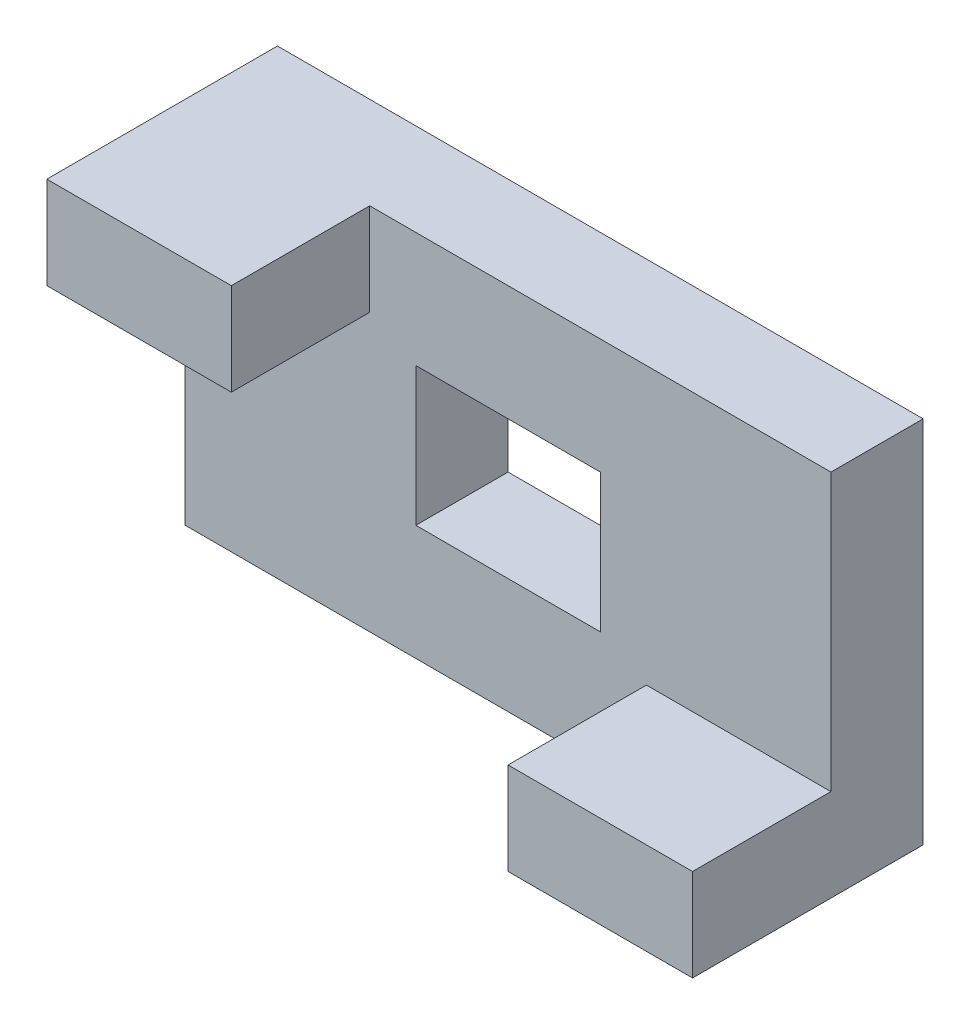
ISO-10303-21;
HEADER;
FILE_DESCRIPTION(('STEP AP214'),'2;1');
FILE_NAME('part.step','',(''),(''),'','','');
FILE_SCHEMA(('AUTOMOTIVE_DESIGN { 1 0 10303 214 1 1 1 1 }'));
ENDSEC;
DATA;
#1=APPLICATION_CONTEXT('core data for automotive mechanical design processes');
#2=APPLICATION_PROTOCOL_DEFINITION('international standard','automotive_design',2000,#1);
#3=PRODUCT_CONTEXT('',#1,'mechanical');
#4=PRODUCT('Part','Part','',(#3));
#5=PRODUCT_RELATED_PRODUCT_CATEGORY('part','',(#4));
#6=PRODUCT_DEFINITION_FORMATION('','',#4);
#7=PRODUCT_DEFINITION_CONTEXT('part definition',#1,'design');
#8=PRODUCT_DEFINITION('design','',#6,#7);
#9=PRODUCT_DEFINITION_SHAPE('','',#8);
#10=(LENGTH_UNIT() NAMED_UNIT(*) SI_UNIT(.MILLI.,.METRE.));
#11=(NAMED_UNIT(*) PLANE_ANGLE_UNIT() SI_UNIT($,.RADIAN.));
#12=(NAMED_UNIT(*) SI_UNIT($,.STERADIAN.) SOLID_ANGLE_UNIT());
#13=UNCERTAINTY_MEASURE_WITH_UNIT(LENGTH_MEASURE(1.E-05),#10,'distance_accuracy_value','');
#14=(GEOMETRIC_REPRESENTATION_CONTEXT(3) GLOBAL_UNCERTAINTY_ASSIGNED_CONTEXT((#13)) GLOBAL_UNIT_ASSIGNED_CONTEXT((#10,
#11,#12)) REPRESENTATION_CONTEXT('',''));
#15=CARTESIAN_POINT('',(0.,0.,0.));
#16=DIRECTION('',(0.,0.,1.));
#17=DIRECTION('',(1.,0.,0.));
#18=AXIS2_PLACEMENT_3D('',#15,#16,#17);
#19=CARTESIAN_POINT('',(0.,-10.,8.));
#20=DIRECTION('',(0.,1.,0.));
#21=DIRECTION('',(0.,0.,1.));
#22=AXIS2_PLACEMENT_3D('',#19,#20,#21);
#23=PLANE('',#22);
#24=DIRECTION('',(1.,0.,0.));
#25=VECTOR('',#24,1.);
#26=CARTESIAN_POINT('',(0.,-10.,0.));
#27=LINE('',#26,#25);
#28=CARTESIAN_POINT('',(20.,-10.,0.));
#29=VERTEX_POINT('',#28);
#30=CARTESIAN_POINT('',(36.,-10.,0.));
#31=VERTEX_POINT('',#30);
#32=EDGE_CURVE('E151',#29,#31,#27,.T.);
#33=ORIENTED_EDGE('',*,*,#32,.T.);
#34=DIRECTION('',(0.,0.,-1.));
#35=VECTOR('',#34,1.);
#36=CARTESIAN_POINT('',(36.,-10.,8.));
#37=LINE('',#36,#35);
#38=CARTESIAN_POINT('',(36.,-10.,8.));
#39=VERTEX_POINT('',#38);
#40=EDGE_CURVE('E11',#39,#31,#37,.T.);
#41=ORIENTED_EDGE('',*,*,#40,.F.);
#42=DIRECTION('',(1.,0.,0.));
#43=VECTOR('',#42,1.);
#44=CARTESIAN_POINT('',(0.,-10.,8.));
#45=LINE('',#44,#43);
#46=CARTESIAN_POINT('',(20.,-10.,8.));
#47=VERTEX_POINT('',#46);
#48=EDGE_CURVE('E114',#47,#39,#45,.T.);
#49=ORIENTED_EDGE('',*,*,#48,.F.);
#50=DIRECTION('',(0.,0.,-1.));
#51=VECTOR('',#50,1.);
#52=CARTESIAN_POINT('',(20.,-10.,8.));
#53=LINE('',#52,#51);
#54=EDGE_CURVE('E63',#47,#29,#53,.T.);
#55=ORIENTED_EDGE('',*,*,#54,.T.);
#56=EDGE_LOOP('',(#33,#41,#49,#55));
#57=FACE_BOUND('',#56,.T.);
#58=ADVANCED_FACE('F43',(#57),#23,.F.);
#59=CARTESIAN_POINT('',(36.,0.,8.));
#60=DIRECTION('',(1.,0.,0.));
#61=DIRECTION('',(0.,0.,-1.));
#62=AXIS2_PLACEMENT_3D('',#59,#60,#61);
#63=PLANE('',#62);
#64=DIRECTION('',(0.,-1.,0.));
#65=VECTOR('',#64,1.);
#66=CARTESIAN_POINT('',(36.,0.,0.));
#67=LINE('',#66,#65);
#68=CARTESIAN_POINT('',(36.,-22.,0.));
#69=VERTEX_POINT('',#68);
#70=EDGE_CURVE('E121',#31,#69,#67,.T.);
#71=ORIENTED_EDGE('',*,*,#70,.T.);
#72=DIRECTION('',(0.,0.,-1.));
#73=VECTOR('',#72,1.);
#74=CARTESIAN_POINT('',(36.,-22.,8.));
#75=LINE('',#74,#73);
#76=CARTESIAN_POINT('',(36.,-22.,8.));
#77=VERTEX_POINT('',#76);
#78=EDGE_CURVE('E54',#77,#69,#75,.T.);
#79=ORIENTED_EDGE('',*,*,#78,.F.);
#80=DIRECTION('',(0.,-1.,0.));
#81=VECTOR('',#80,1.);
#82=CARTESIAN_POINT('',(36.,0.,8.));
#83=LINE('',#82,#81);
#84=EDGE_CURVE('E108',#39,#77,#83,.T.);
#85=ORIENTED_EDGE('',*,*,#84,.F.);
#86=ORIENTED_EDGE('',*,*,#40,.T.);
#87=EDGE_LOOP('',(#71,#79,#85,#86));
#88=FACE_BOUND('',#87,.T.);
#89=ADVANCED_FACE('F120',(#88),#63,.F.);
#90=CARTESIAN_POINT('',(0.,-22.,8.));
#91=DIRECTION('',(0.,1.,0.));
#92=DIRECTION('',(0.,0.,1.));
#93=AXIS2_PLACEMENT_3D('',#90,#91,#92);
#94=PLANE('',#93);
#95=DIRECTION('',(1.,0.,0.));
#96=VECTOR('',#95,1.);
#97=CARTESIAN_POINT('',(0.,-22.,0.));
#98=LINE('',#97,#96);
#99=CARTESIAN_POINT('',(20.,-22.,0.));
#100=VERTEX_POINT('',#99);
#101=EDGE_CURVE('E156',#100,#69,#98,.T.);
#102=ORIENTED_EDGE('',*,*,#101,.F.);
#103=DIRECTION('',(0.,0.,-1.));
#104=VECTOR('',#103,1.);
#105=CARTESIAN_POINT('',(20.,-22.,8.));
#106=LINE('',#105,#104);
#107=CARTESIAN_POINT('',(20.,-22.,8.));
#108=VERTEX_POINT('',#107);
#109=EDGE_CURVE('E84',#108,#100,#106,.T.);
#110=ORIENTED_EDGE('',*,*,#109,.F.);
#111=DIRECTION('',(1.,0.,0.));
#112=VECTOR('',#111,1.);
#113=CARTESIAN_POINT('',(0.,-22.,8.));
#114=LINE('',#113,#112);
#115=EDGE_CURVE('E113',#108,#77,#114,.T.);
#116=ORIENTED_EDGE('',*,*,#115,.T.);
#117=ORIENTED_EDGE('',*,*,#78,.T.);
#118=EDGE_LOOP('',(#102,#110,#116,#117));
#119=FACE_BOUND('',#118,.T.);
#120=ADVANCED_FACE('F126',(#119),#94,.T.);
#121=CARTESIAN_POINT('',(56.,0.,8.));
#122=DIRECTION('',(1.,0.,0.));
#123=DIRECTION('',(0.,1.,0.));
#124=AXIS2_PLACEMENT_3D('',#121,#122,#123);
#125=PLANE('',#124);
#126=DIRECTION('',(0.,-1.,0.));
#127=VECTOR('',#126,1.);
#128=CARTESIAN_POINT('',(56.,0.,0.));
#129=LINE('',#128,#127);
#130=CARTESIAN_POINT('',(56.,0.,0.));
#131=VERTEX_POINT('',#130);
#132=CARTESIAN_POINT('',(56.,-32.,0.));
#133=VERTEX_POINT('',#132);
#134=EDGE_CURVE('E135',#131,#133,#129,.T.);
#135=ORIENTED_EDGE('',*,*,#134,.F.);
#136=DIRECTION('',(0.,0.,-1.));
#137=VECTOR('',#136,1.);
#138=CARTESIAN_POINT('',(56.,0.,8.));
#139=LINE('',#138,#137);
#140=CARTESIAN_POINT('',(56.,0.,8.));
#141=VERTEX_POINT('',#140);
#142=EDGE_CURVE('E47',#141,#131,#139,.T.);
#143=ORIENTED_EDGE('',*,*,#142,.F.);
#144=DIRECTION('',(0.,-1.,0.));
#145=VECTOR('',#144,1.);
#146=CARTESIAN_POINT('',(56.,0.,8.));
#147=LINE('',#146,#145);
#148=CARTESIAN_POINT('',(56.,-24.,8.));
#149=VERTEX_POINT('',#148);
#150=EDGE_CURVE('E224',#141,#149,#147,.T.);
#151=ORIENTED_EDGE('',*,*,#150,.T.);
#152=DIRECTION('',(0.,0.,-1.));
#153=VECTOR('',#152,1.);
#154=CARTESIAN_POINT('',(56.,-24.,20.));
#155=LINE('',#154,#153);
#156=CARTESIAN_POINT('',(56.,-24.,20.));
#157=VERTEX_POINT('',#156);
#158=EDGE_CURVE('E269',#157,#149,#155,.T.);
#159=ORIENTED_EDGE('',*,*,#158,.F.);
#160=DIRECTION('',(0.,-1.,0.));
#161=VECTOR('',#160,1.);
#162=CARTESIAN_POINT('',(56.,0.,20.));
#163=LINE('',#162,#161);
#164=CARTESIAN_POINT('',(56.,-32.,20.));
#165=VERTEX_POINT('',#164);
#166=EDGE_CURVE('E330',#157,#165,#163,.T.);
#167=ORIENTED_EDGE('',*,*,#166,.T.);
#168=DIRECTION('',(0.,0.,-1.));
#169=VECTOR('',#168,1.);
#170=CARTESIAN_POINT('',(56.,-32.,20.));
#171=LINE('',#170,#169);
#172=EDGE_CURVE('E188',#165,#133,#171,.T.);
#173=ORIENTED_EDGE('',*,*,#172,.T.);
#174=EDGE_LOOP('',(#135,#143,#151,#159,#167,#173));
#175=FACE_BOUND('',#174,.T.);
#176=ADVANCED_FACE('F45',(#175),#125,.T.);
#177=CARTESIAN_POINT('',(0.,0.,8.));
#178=DIRECTION('',(0.,1.,0.));
#179=DIRECTION('',(0.,0.,1.));
#180=AXIS2_PLACEMENT_3D('',#177,#178,#179);
#181=PLANE('',#180);
#182=DIRECTION('',(1.,0.,0.));
#183=VECTOR('',#182,1.);
#184=CARTESIAN_POINT('',(0.,0.,0.));
#185=LINE('',#184,#183);
#186=CARTESIAN_POINT('',(0.,0.,0.));
#187=VERTEX_POINT('',#186);
#188=EDGE_CURVE('E139',#187,#131,#185,.T.);
#189=ORIENTED_EDGE('',*,*,#188,.F.);
#190=DIRECTION('',(0.,0.,-1.));
#191=VECTOR('',#190,1.);
#192=CARTESIAN_POINT('',(0.,0.,20.));
#193=LINE('',#192,#191);
#194=CARTESIAN_POINT('',(0.,0.,20.));
#195=VERTEX_POINT('',#194);
#196=EDGE_CURVE('E198',#195,#187,#193,.T.);
#197=ORIENTED_EDGE('',*,*,#196,.F.);
#198=DIRECTION('',(1.,0.,0.));
#199=VECTOR('',#198,1.);
#200=CARTESIAN_POINT('',(0.,0.,20.));
#201=LINE('',#200,#199);
#202=CARTESIAN_POINT('',(16.,0.,20.));
#203=VERTEX_POINT('',#202);
#204=EDGE_CURVE('E276',#195,#203,#201,.T.);
#205=ORIENTED_EDGE('',*,*,#204,.T.);
#206=DIRECTION('',(0.,0.,-1.));
#207=VECTOR('',#206,1.);
#208=CARTESIAN_POINT('',(16.,0.,20.));
#209=LINE('',#208,#207);
#210=CARTESIAN_POINT('',(16.,0.,8.));
#211=VERTEX_POINT('',#210);
#212=EDGE_CURVE('E140',#203,#211,#209,.T.);
#213=ORIENTED_EDGE('',*,*,#212,.T.);
#214=DIRECTION('',(1.,0.,0.));
#215=VECTOR('',#214,1.);
#216=CARTESIAN_POINT('',(0.,0.,8.));
#217=LINE('',#216,#215);
#218=EDGE_CURVE('E183',#211,#141,#217,.T.);
#219=ORIENTED_EDGE('',*,*,#218,.T.);
#220=ORIENTED_EDGE('',*,*,#142,.T.);
#221=EDGE_LOOP('',(#189,#197,#205,#213,#219,#220));
#222=FACE_BOUND('',#221,.T.);
#223=ADVANCED_FACE('F177',(#222),#181,.T.);
#224=CARTESIAN_POINT('',(0.,0.,8.));
#225=DIRECTION('',(1.,0.,0.));
#226=DIRECTION('',(0.,0.,-1.));
#227=AXIS2_PLACEMENT_3D('',#224,#225,#226);
#228=PLANE('',#227);
#229=DIRECTION('',(0.,-1.,0.));
#230=VECTOR('',#229,1.);
#231=CARTESIAN_POINT('',(0.,0.,0.));
#232=LINE('',#231,#230);
#233=CARTESIAN_POINT('',(0.,-32.,0.));
#234=VERTEX_POINT('',#233);
#235=EDGE_CURVE('E144',#187,#234,#232,.T.);
#236=ORIENTED_EDGE('',*,*,#235,.T.);
#237=DIRECTION('',(0.,0.,-1.));
#238=VECTOR('',#237,1.);
#239=CARTESIAN_POINT('',(0.,-32.,8.));
#240=LINE('',#239,#238);
#241=CARTESIAN_POINT('',(0.,-32.,8.));
#242=VERTEX_POINT('',#241);
#243=EDGE_CURVE('E131',#242,#234,#240,.T.);
#244=ORIENTED_EDGE('',*,*,#243,.F.);
#245=DIRECTION('',(0.,-1.,0.));
#246=VECTOR('',#245,1.);
#247=CARTESIAN_POINT('',(0.,0.,8.));
#248=LINE('',#247,#246);
#249=CARTESIAN_POINT('',(0.,-8.,8.));
#250=VERTEX_POINT('',#249);
#251=EDGE_CURVE('E237',#250,#242,#248,.T.);
#252=ORIENTED_EDGE('',*,*,#251,.F.);
#253=DIRECTION('',(0.,0.,-1.));
#254=VECTOR('',#253,1.);
#255=CARTESIAN_POINT('',(0.,-8.,20.));
#256=LINE('',#255,#254);
#257=CARTESIAN_POINT('',(0.,-8.,20.));
#258=VERTEX_POINT('',#257);
#259=EDGE_CURVE('E207',#258,#250,#256,.T.);
#260=ORIENTED_EDGE('',*,*,#259,.F.);
#261=DIRECTION('',(0.,-1.,0.));
#262=VECTOR('',#261,1.);
#263=CARTESIAN_POINT('',(0.,0.,20.));
#264=LINE('',#263,#262);
#265=EDGE_CURVE('E203',#195,#258,#264,.T.);
#266=ORIENTED_EDGE('',*,*,#265,.F.);
#267=ORIENTED_EDGE('',*,*,#196,.T.);
#268=EDGE_LOOP('',(#236,#244,#252,#260,#266,#267));
#269=FACE_BOUND('',#268,.T.);
#270=ADVANCED_FACE('F199',(#269),#228,.F.);
#271=CARTESIAN_POINT('',(0.,-32.,8.));
#272=DIRECTION('',(0.,1.,0.));
#273=DIRECTION('',(0.,0.,1.));
#274=AXIS2_PLACEMENT_3D('',#271,#272,#273);
#275=PLANE('',#274);
#276=DIRECTION('',(1.,0.,0.));
#277=VECTOR('',#276,1.);
#278=CARTESIAN_POINT('',(0.,-32.,0.));
#279=LINE('',#278,#277);
#280=EDGE_CURVE('E147',#234,#133,#279,.T.);
#281=ORIENTED_EDGE('',*,*,#280,.T.);
#282=ORIENTED_EDGE('',*,*,#172,.F.);
#283=DIRECTION('',(1.,0.,0.));
#284=VECTOR('',#283,1.);
#285=CARTESIAN_POINT('',(0.,-32.,20.));
#286=LINE('',#285,#284);
#287=CARTESIAN_POINT('',(40.,-32.,20.));
#288=VERTEX_POINT('',#287);
#289=EDGE_CURVE('E258',#288,#165,#286,.T.);
#290=ORIENTED_EDGE('',*,*,#289,.F.);
#291=DIRECTION('',(0.,0.,-1.));
#292=VECTOR('',#291,1.);
#293=CARTESIAN_POINT('',(40.,-32.,20.));
#294=LINE('',#293,#292);
#295=CARTESIAN_POINT('',(40.,-32.,8.));
#296=VERTEX_POINT('',#295);
#297=EDGE_CURVE('E255',#288,#296,#294,.T.);
#298=ORIENTED_EDGE('',*,*,#297,.T.);
#299=DIRECTION('',(1.,0.,0.));
#300=VECTOR('',#299,1.);
#301=CARTESIAN_POINT('',(0.,-32.,8.));
#302=LINE('',#301,#300);
#303=EDGE_CURVE('E240',#242,#296,#302,.T.);
#304=ORIENTED_EDGE('',*,*,#303,.F.);
#305=ORIENTED_EDGE('',*,*,#243,.T.);
#306=EDGE_LOOP('',(#281,#282,#290,#298,#304,#305));
#307=FACE_BOUND('',#306,.T.);
#308=ADVANCED_FACE('F252',(#307),#275,.F.);
#309=CARTESIAN_POINT('',(20.,0.,8.));
#310=DIRECTION('',(1.,0.,0.));
#311=DIRECTION('',(0.,0.,-1.));
#312=AXIS2_PLACEMENT_3D('',#309,#310,#311);
#313=PLANE('',#312);
#314=DIRECTION('',(0.,-1.,0.));
#315=VECTOR('',#314,1.);
#316=CARTESIAN_POINT('',(20.,0.,0.));
#317=LINE('',#316,#315);
#318=EDGE_CURVE('E159',#29,#100,#317,.T.);
#319=ORIENTED_EDGE('',*,*,#318,.F.);
#320=ORIENTED_EDGE('',*,*,#54,.F.);
#321=DIRECTION('',(0.,-1.,0.));
#322=VECTOR('',#321,1.);
#323=CARTESIAN_POINT('',(20.,0.,8.));
#324=LINE('',#323,#322);
#325=EDGE_CURVE('E128',#47,#108,#324,.T.);
#326=ORIENTED_EDGE('',*,*,#325,.T.);
#327=ORIENTED_EDGE('',*,*,#109,.T.);
#328=EDGE_LOOP('',(#319,#320,#326,#327));
#329=FACE_BOUND('',#328,.T.);
#330=ADVANCED_FACE('F354',(#329),#313,.T.);
#331=CARTESIAN_POINT('',(0.,0.,8.));
#332=DIRECTION('',(0.,0.,1.));
#333=DIRECTION('',(1.,0.,0.));
#334=AXIS2_PLACEMENT_3D('',#331,#332,#333);
#335=PLANE('',#334);
#336=DIRECTION('',(0.,-1.,0.));
#337=VECTOR('',#336,1.);
#338=CARTESIAN_POINT('',(40.,0.,8.));
#339=LINE('',#338,#337);
#340=CARTESIAN_POINT('',(40.,-24.,8.));
#341=VERTEX_POINT('',#340);
#342=EDGE_CURVE('E163',#341,#296,#339,.T.);
#343=ORIENTED_EDGE('',*,*,#342,.F.);
#344=DIRECTION('',(1.,0.,0.));
#345=VECTOR('',#344,1.);
#346=CARTESIAN_POINT('',(0.,-24.,8.));
#347=LINE('',#346,#345);
#348=EDGE_CURVE('E220',#341,#149,#347,.T.);
#349=ORIENTED_EDGE('',*,*,#348,.T.);
#350=ORIENTED_EDGE('',*,*,#150,.F.);
#351=ORIENTED_EDGE('',*,*,#218,.F.);
#352=DIRECTION('',(0.,-1.,0.));
#353=VECTOR('',#352,1.);
#354=CARTESIAN_POINT('',(16.,0.,8.));
#355=LINE('',#354,#353);
#356=CARTESIAN_POINT('',(16.,-8.,8.));
#357=VERTEX_POINT('',#356);
#358=EDGE_CURVE('E229',#211,#357,#355,.T.);
#359=ORIENTED_EDGE('',*,*,#358,.T.);
#360=DIRECTION('',(1.,0.,0.));
#361=VECTOR('',#360,1.);
#362=CARTESIAN_POINT('',(0.,-8.,8.));
#363=LINE('',#362,#361);
#364=EDGE_CURVE('E233',#250,#357,#363,.T.);
#365=ORIENTED_EDGE('',*,*,#364,.F.);
#366=ORIENTED_EDGE('',*,*,#251,.T.);
#367=ORIENTED_EDGE('',*,*,#303,.T.);
#368=EDGE_LOOP('',(#343,#349,#350,#351,#359,#365,#366,#367));
#369=FACE_BOUND('',#368,.T.);
#370=ORIENTED_EDGE('',*,*,#48,.T.);
#371=ORIENTED_EDGE('',*,*,#84,.T.);
#372=ORIENTED_EDGE('',*,*,#115,.F.);
#373=ORIENTED_EDGE('',*,*,#325,.F.);
#374=EDGE_LOOP('',(#370,#371,#372,#373));
#375=FACE_BOUND('',#374,.T.);
#376=ADVANCED_FACE('F110',(#369,#375),#335,.T.);
#377=CARTESIAN_POINT('',(0.,0.,0.));
#378=DIRECTION('',(0.,0.,1.));
#379=DIRECTION('',(1.,0.,0.));
#380=AXIS2_PLACEMENT_3D('',#377,#378,#379);
#381=PLANE('',#380);
#382=ORIENTED_EDGE('',*,*,#134,.T.);
#383=ORIENTED_EDGE('',*,*,#280,.F.);
#384=ORIENTED_EDGE('',*,*,#235,.F.);
#385=ORIENTED_EDGE('',*,*,#188,.T.);
#386=EDGE_LOOP('',(#382,#383,#384,#385));
#387=FACE_BOUND('',#386,.T.);
#388=ORIENTED_EDGE('',*,*,#32,.F.);
#389=ORIENTED_EDGE('',*,*,#318,.T.);
#390=ORIENTED_EDGE('',*,*,#101,.T.);
#391=ORIENTED_EDGE('',*,*,#70,.F.);
#392=EDGE_LOOP('',(#388,#389,#390,#391));
#393=FACE_BOUND('',#392,.T.);
#394=ADVANCED_FACE('F190',(#387,#393),#381,.F.);
#395=CARTESIAN_POINT('',(16.,0.,20.));
#396=DIRECTION('',(1.,0.,0.));
#397=DIRECTION('',(0.,1.,0.));
#398=AXIS2_PLACEMENT_3D('',#395,#396,#397);
#399=PLANE('',#398);
#400=DIRECTION('',(0.,0.,-1.));
#401=VECTOR('',#400,1.);
#402=CARTESIAN_POINT('',(16.,-8.,20.));
#403=LINE('',#402,#401);
#404=CARTESIAN_POINT('',(16.,-8.,20.));
#405=VERTEX_POINT('',#404);
#406=EDGE_CURVE('E213',#405,#357,#403,.T.);
#407=ORIENTED_EDGE('',*,*,#406,.T.);
#408=ORIENTED_EDGE('',*,*,#358,.F.);
#409=ORIENTED_EDGE('',*,*,#212,.F.);
#410=DIRECTION('',(0.,-1.,0.));
#411=VECTOR('',#410,1.);
#412=CARTESIAN_POINT('',(16.,0.,20.));
#413=LINE('',#412,#411);
#414=EDGE_CURVE('E267',#203,#405,#413,.T.);
#415=ORIENTED_EDGE('',*,*,#414,.T.);
#416=EDGE_LOOP('',(#407,#408,#409,#415));
#417=FACE_BOUND('',#416,.T.);
#418=ADVANCED_FACE('F290',(#417),#399,.T.);
#419=CARTESIAN_POINT('',(0.,-8.,20.));
#420=DIRECTION('',(0.,1.,0.));
#421=DIRECTION('',(0.,0.,1.));
#422=AXIS2_PLACEMENT_3D('',#419,#420,#421);
#423=PLANE('',#422);
#424=ORIENTED_EDGE('',*,*,#364,.T.);
#425=ORIENTED_EDGE('',*,*,#406,.F.);
#426=DIRECTION('',(1.,0.,0.));
#427=VECTOR('',#426,1.);
#428=CARTESIAN_POINT('',(0.,-8.,20.));
#429=LINE('',#428,#427);
#430=EDGE_CURVE('E281',#258,#405,#429,.T.);
#431=ORIENTED_EDGE('',*,*,#430,.F.);
#432=ORIENTED_EDGE('',*,*,#259,.T.);
#433=EDGE_LOOP('',(#424,#425,#431,#432));
#434=FACE_BOUND('',#433,.T.);
#435=ADVANCED_FACE('F374',(#434),#423,.F.);
#436=CARTESIAN_POINT('',(0.,0.,20.));
#437=DIRECTION('',(0.,0.,1.));
#438=DIRECTION('',(1.,0.,0.));
#439=AXIS2_PLACEMENT_3D('',#436,#437,#438);
#440=PLANE('',#439);
#441=ORIENTED_EDGE('',*,*,#414,.F.);
#442=ORIENTED_EDGE('',*,*,#204,.F.);
#443=ORIENTED_EDGE('',*,*,#265,.T.);
#444=ORIENTED_EDGE('',*,*,#430,.T.);
#445=EDGE_LOOP('',(#441,#442,#443,#444));
#446=FACE_BOUND('',#445,.T.);
#447=ADVANCED_FACE('F377',(#446),#440,.T.);
#448=CARTESIAN_POINT('',(0.,-24.,20.));
#449=DIRECTION('',(0.,1.,0.));
#450=DIRECTION('',(0.,0.,1.));
#451=AXIS2_PLACEMENT_3D('',#448,#449,#450);
#452=PLANE('',#451);
#453=ORIENTED_EDGE('',*,*,#158,.T.);
#454=ORIENTED_EDGE('',*,*,#348,.F.);
#455=DIRECTION('',(0.,0.,-1.));
#456=VECTOR('',#455,1.);
#457=CARTESIAN_POINT('',(40.,-24.,20.));
#458=LINE('',#457,#456);
#459=CARTESIAN_POINT('',(40.,-24.,20.));
#460=VERTEX_POINT('',#459);
#461=EDGE_CURVE('E262',#460,#341,#458,.T.);
#462=ORIENTED_EDGE('',*,*,#461,.F.);
#463=DIRECTION('',(1.,0.,0.));
#464=VECTOR('',#463,1.);
#465=CARTESIAN_POINT('',(0.,-24.,20.));
#466=LINE('',#465,#464);
#467=EDGE_CURVE('E322',#460,#157,#466,.T.);
#468=ORIENTED_EDGE('',*,*,#467,.T.);
#469=EDGE_LOOP('',(#453,#454,#462,#468));
#470=FACE_BOUND('',#469,.T.);
#471=ADVANCED_FACE('F320',(#470),#452,.T.);
#472=CARTESIAN_POINT('',(40.,0.,20.));
#473=DIRECTION('',(1.,0.,0.));
#474=DIRECTION('',(0.,0.,-1.));
#475=AXIS2_PLACEMENT_3D('',#472,#473,#474);
#476=PLANE('',#475);
#477=ORIENTED_EDGE('',*,*,#342,.T.);
#478=ORIENTED_EDGE('',*,*,#297,.F.);
#479=DIRECTION('',(0.,-1.,0.));
#480=VECTOR('',#479,1.);
#481=CARTESIAN_POINT('',(40.,0.,20.));
#482=LINE('',#481,#480);
#483=EDGE_CURVE('E324',#460,#288,#482,.T.);
#484=ORIENTED_EDGE('',*,*,#483,.F.);
#485=ORIENTED_EDGE('',*,*,#461,.T.);
#486=EDGE_LOOP('',(#477,#478,#484,#485));
#487=FACE_BOUND('',#486,.T.);
#488=ADVANCED_FACE('F325',(#487),#476,.F.);
#489=CARTESIAN_POINT('',(0.,0.,20.));
#490=DIRECTION('',(0.,0.,1.));
#491=DIRECTION('',(1.,0.,0.));
#492=AXIS2_PLACEMENT_3D('',#489,#490,#491);
#493=PLANE('',#492);
#494=ORIENTED_EDGE('',*,*,#467,.F.);
#495=ORIENTED_EDGE('',*,*,#483,.T.);
#496=ORIENTED_EDGE('',*,*,#289,.T.);
#497=ORIENTED_EDGE('',*,*,#166,.F.);
#498=EDGE_LOOP('',(#494,#495,#496,#497));
#499=FACE_BOUND('',#498,.T.);
#500=ADVANCED_FACE('F329',(#499),#493,.T.);
#501=CLOSED_SHELL('',(#58,#89,#120,#176,#223,#270,#308,#330,#376,#394,#418,#435,#447,#471,#488,#500));
#502=MANIFOLD_SOLID_BREP('B2',#501);
#503=ADVANCED_BREP_SHAPE_REPRESENTATION('',(#18,#502),#14);
#504=SHAPE_DEFINITION_REPRESENTATION(#9,#503);
ENDSEC;
END-ISO-10303-21;
